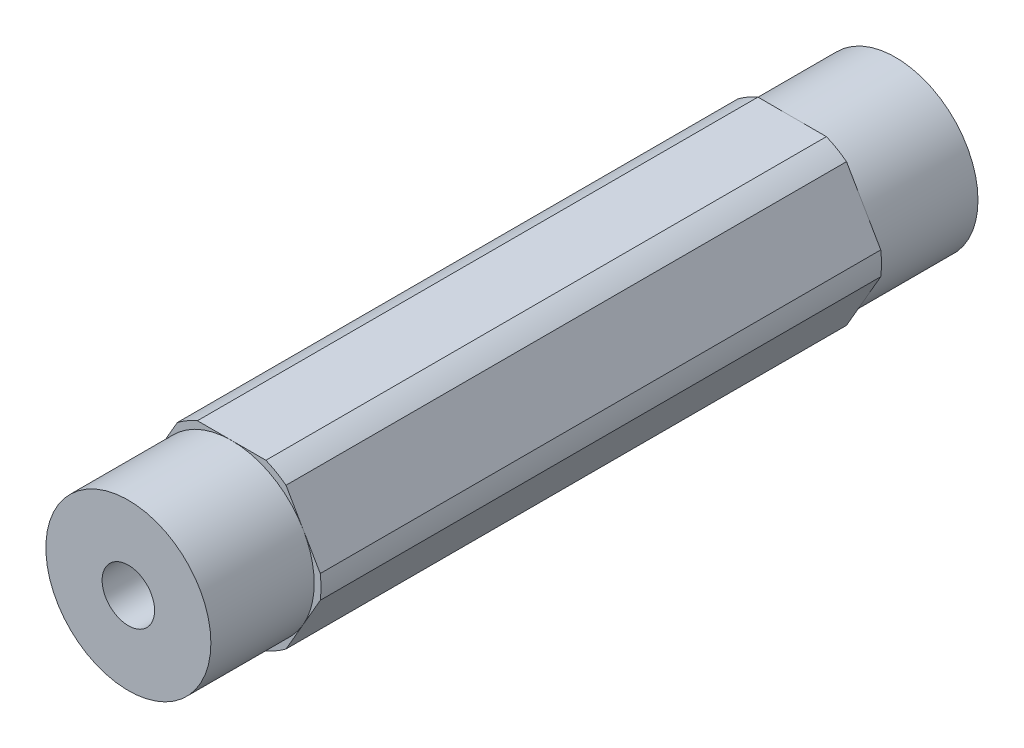
ISO-10303-21;
HEADER;
FILE_DESCRIPTION(('STEP AP214'),'2;1');
FILE_NAME('part.step','',(''),(''),'','','');
FILE_SCHEMA(('AUTOMOTIVE_DESIGN { 1 0 10303 214 1 1 1 1 }'));
ENDSEC;
DATA;
#1=APPLICATION_CONTEXT('core data for automotive mechanical design processes');
#2=APPLICATION_PROTOCOL_DEFINITION('international standard','automotive_design',2000,#1);
#3=PRODUCT_CONTEXT('',#1,'mechanical');
#4=PRODUCT('Part','Part','',(#3));
#5=PRODUCT_RELATED_PRODUCT_CATEGORY('part','',(#4));
#6=PRODUCT_DEFINITION_FORMATION('','',#4);
#7=PRODUCT_DEFINITION_CONTEXT('part definition',#1,'design');
#8=PRODUCT_DEFINITION('design','',#6,#7);
#9=PRODUCT_DEFINITION_SHAPE('','',#8);
#10=(LENGTH_UNIT() NAMED_UNIT(*) SI_UNIT(.MILLI.,.METRE.));
#11=(NAMED_UNIT(*) PLANE_ANGLE_UNIT() SI_UNIT($,.RADIAN.));
#12=(NAMED_UNIT(*) SI_UNIT($,.STERADIAN.) SOLID_ANGLE_UNIT());
#13=UNCERTAINTY_MEASURE_WITH_UNIT(LENGTH_MEASURE(1.E-05),#10,'distance_accuracy_value','');
#14=(GEOMETRIC_REPRESENTATION_CONTEXT(3) GLOBAL_UNCERTAINTY_ASSIGNED_CONTEXT((#13)) GLOBAL_UNIT_ASSIGNED_CONTEXT((#10,
#11,#12)) REPRESENTATION_CONTEXT('',''));
#15=CARTESIAN_POINT('',(0.,0.,0.));
#16=DIRECTION('',(0.,0.,1.));
#17=DIRECTION('',(1.,0.,0.));
#18=AXIS2_PLACEMENT_3D('',#15,#16,#17);
#19=CARTESIAN_POINT('',(3.66617420935409,6.34999999999998,29.51734));
#20=DIRECTION('',(0.,-1.,0.));
#21=DIRECTION('',(1.,0.,0.));
#22=AXIS2_PLACEMENT_3D('',#19,#20,#21);
#23=PLANE('',#22);
#24=DIRECTION('',(1.,0.,0.));
#25=VECTOR('',#24,1.);
#26=CARTESIAN_POINT('',(3.66617420935409,6.34999999999998,-21.56714));
#27=LINE('',#26,#25);
#28=CARTESIAN_POINT('',(-2.63498102459971,6.34999999999996,-21.56714));
#29=VERTEX_POINT('',#28);
#30=CARTESIAN_POINT('',(0.,6.34999999999997,-21.56714));
#31=VERTEX_POINT('',#30);
#32=EDGE_CURVE('E216',#29,#31,#27,.T.);
#33=ORIENTED_EDGE('',*,*,#32,.F.);
#34=DIRECTION('',(0.,0.,1.));
#35=VECTOR('',#34,1.);
#36=CARTESIAN_POINT('',(-2.63498102459971,6.34999999999996,-29.51734));
#37=LINE('',#36,#35);
#38=CARTESIAN_POINT('',(-2.63498102459971,6.34999999999996,21.56714));
#39=VERTEX_POINT('',#38);
#40=EDGE_CURVE('E294',#39,#29,#37,.F.);
#41=ORIENTED_EDGE('',*,*,#40,.F.);
#42=DIRECTION('',(-1.,0.,0.));
#43=VECTOR('',#42,1.);
#44=CARTESIAN_POINT('',(3.66617420935409,6.34999999999998,21.56714));
#45=LINE('',#44,#43);
#46=CARTESIAN_POINT('',(0.,6.34999999999997,21.56714));
#47=VERTEX_POINT('',#46);
#48=EDGE_CURVE('E332',#47,#39,#45,.T.);
#49=ORIENTED_EDGE('',*,*,#48,.F.);
#50=CARTESIAN_POINT('',(2.63498102459967,6.34999999999997,21.56714));
#51=VERTEX_POINT('',#50);
#52=EDGE_CURVE('E336',#51,#47,#45,.T.);
#53=ORIENTED_EDGE('',*,*,#52,.F.);
#54=DIRECTION('',(0.,0.,1.));
#55=VECTOR('',#54,1.);
#56=CARTESIAN_POINT('',(2.63498102459967,6.34999999999997,-29.51734));
#57=LINE('',#56,#55);
#58=CARTESIAN_POINT('',(2.63498102459967,6.34999999999997,-21.56714));
#59=VERTEX_POINT('',#58);
#60=EDGE_CURVE('E69',#59,#51,#57,.T.);
#61=ORIENTED_EDGE('',*,*,#60,.F.);
#62=EDGE_CURVE('E63',#31,#59,#27,.T.);
#63=ORIENTED_EDGE('',*,*,#62,.F.);
#64=EDGE_LOOP('',(#33,#41,#49,#53,#61,#63));
#65=FACE_BOUND('',#64,.T.);
#66=ADVANCED_FACE('F48',(#65),#23,.F.);
#67=CARTESIAN_POINT('',(-3.66617420935414,6.34999999999995,29.51734));
#68=DIRECTION('',(0.866025403784441,-0.499999999999995,0.));
#69=DIRECTION('',(0.499999999999995,0.866025403784442,0.));
#70=AXIS2_PLACEMENT_3D('',#67,#68,#69);
#71=PLANE('',#70);
#72=DIRECTION('',(0.499999999999995,0.866025403784442,0.));
#73=VECTOR('',#72,1.);
#74=CARTESIAN_POINT('',(-3.66617420935414,6.34999999999995,-21.56714));
#75=LINE('',#74,#73);
#76=CARTESIAN_POINT('',(-6.816751826331,0.893039494206666,-21.56714));
#77=VERTEX_POINT('',#76);
#78=CARTESIAN_POINT('',(-5.49926131403117,3.17499999999995,-21.56714));
#79=VERTEX_POINT('',#78);
#80=EDGE_CURVE('E213',#77,#79,#75,.T.);
#81=ORIENTED_EDGE('',*,*,#80,.F.);
#82=DIRECTION('',(0.,0.,1.));
#83=VECTOR('',#82,1.);
#84=CARTESIAN_POINT('',(-6.81675182633101,0.893039494206661,-29.51734));
#85=LINE('',#84,#83);
#86=CARTESIAN_POINT('',(-6.81675182633101,0.893039494206666,21.56714));
#87=VERTEX_POINT('',#86);
#88=EDGE_CURVE('E283',#87,#77,#85,.F.);
#89=ORIENTED_EDGE('',*,*,#88,.F.);
#90=DIRECTION('',(-0.499999999999995,-0.866025403784442,0.));
#91=VECTOR('',#90,1.);
#92=CARTESIAN_POINT('',(-3.66617420935414,6.34999999999995,21.56714));
#93=LINE('',#92,#91);
#94=CARTESIAN_POINT('',(-5.49926131403117,3.17499999999995,21.56714));
#95=VERTEX_POINT('',#94);
#96=EDGE_CURVE('E327',#95,#87,#93,.T.);
#97=ORIENTED_EDGE('',*,*,#96,.F.);
#98=CARTESIAN_POINT('',(-4.18177080173135,5.45696050579324,21.56714));
#99=VERTEX_POINT('',#98);
#100=EDGE_CURVE('E331',#99,#95,#93,.T.);
#101=ORIENTED_EDGE('',*,*,#100,.F.);
#102=DIRECTION('',(0.,0.,1.));
#103=VECTOR('',#102,1.);
#104=CARTESIAN_POINT('',(-4.18177080173134,5.45696050579324,-29.51734));
#105=LINE('',#104,#103);
#106=CARTESIAN_POINT('',(-4.18177080173134,5.45696050579324,-21.56714));
#107=VERTEX_POINT('',#106);
#108=EDGE_CURVE('E291',#107,#99,#105,.T.);
#109=ORIENTED_EDGE('',*,*,#108,.F.);
#110=EDGE_CURVE('E209',#79,#107,#75,.T.);
#111=ORIENTED_EDGE('',*,*,#110,.F.);
#112=EDGE_LOOP('',(#81,#89,#97,#101,#109,#111));
#113=FACE_BOUND('',#112,.T.);
#114=ADVANCED_FACE('F405',(#113),#71,.F.);
#115=CARTESIAN_POINT('',(-7.33234841870821,0.,29.51734));
#116=DIRECTION('',(0.866025403784434,0.500000000000007,0.));
#117=DIRECTION('',(-0.500000000000007,0.866025403784435,0.));
#118=AXIS2_PLACEMENT_3D('',#115,#116,#117);
#119=PLANE('',#118);
#120=DIRECTION('',(-0.500000000000007,0.866025403784435,0.));
#121=VECTOR('',#120,1.);
#122=CARTESIAN_POINT('',(-7.33234841870821,0.,-21.56714));
#123=LINE('',#122,#121);
#124=CARTESIAN_POINT('',(-4.18177080173127,-5.4569605057933,-21.56714));
#125=VERTEX_POINT('',#124);
#126=CARTESIAN_POINT('',(-5.49926131403113,-3.17500000000003,-21.56714));
#127=VERTEX_POINT('',#126);
#128=EDGE_CURVE('E235',#125,#127,#123,.T.);
#129=ORIENTED_EDGE('',*,*,#128,.F.);
#130=DIRECTION('',(0.,0.,1.));
#131=VECTOR('',#130,1.);
#132=CARTESIAN_POINT('',(-4.18177080173126,-5.4569605057933,-29.51734));
#133=LINE('',#132,#131);
#134=CARTESIAN_POINT('',(-4.18177080173127,-5.4569605057933,21.56714));
#135=VERTEX_POINT('',#134);
#136=EDGE_CURVE('E272',#135,#125,#133,.F.);
#137=ORIENTED_EDGE('',*,*,#136,.F.);
#138=DIRECTION('',(0.500000000000007,-0.866025403784435,0.));
#139=VECTOR('',#138,1.);
#140=CARTESIAN_POINT('',(-7.33234841870821,0.,21.56714));
#141=LINE('',#140,#139);
#142=CARTESIAN_POINT('',(-5.49926131403113,-3.17500000000003,21.56714));
#143=VERTEX_POINT('',#142);
#144=EDGE_CURVE('E322',#143,#135,#141,.T.);
#145=ORIENTED_EDGE('',*,*,#144,.F.);
#146=CARTESIAN_POINT('',(-6.81675182633099,-0.893039494206761,21.56714));
#147=VERTEX_POINT('',#146);
#148=EDGE_CURVE('E326',#147,#143,#141,.T.);
#149=ORIENTED_EDGE('',*,*,#148,.F.);
#150=DIRECTION('',(0.,0.,1.));
#151=VECTOR('',#150,1.);
#152=CARTESIAN_POINT('',(-6.81675182633099,-0.893039494206754,-29.51734));
#153=LINE('',#152,#151);
#154=CARTESIAN_POINT('',(-6.81675182633099,-0.893039494206759,-21.56714));
#155=VERTEX_POINT('',#154);
#156=EDGE_CURVE('E280',#155,#147,#153,.T.);
#157=ORIENTED_EDGE('',*,*,#156,.F.);
#158=EDGE_CURVE('E231',#127,#155,#123,.T.);
#159=ORIENTED_EDGE('',*,*,#158,.F.);
#160=EDGE_LOOP('',(#129,#137,#145,#149,#157,#159));
#161=FACE_BOUND('',#160,.T.);
#162=ADVANCED_FACE('F457',(#161),#119,.F.);
#163=CARTESIAN_POINT('',(-3.66617420935405,-6.35,29.51734));
#164=DIRECTION('',(0.,1.,0.));
#165=DIRECTION('',(-1.,0.,0.));
#166=AXIS2_PLACEMENT_3D('',#163,#164,#165);
#167=PLANE('',#166);
#168=DIRECTION('',(-1.,0.,0.));
#169=VECTOR('',#168,1.);
#170=CARTESIAN_POINT('',(-3.66617420935405,-6.35,-21.56714));
#171=LINE('',#170,#169);
#172=CARTESIAN_POINT('',(2.63498102459976,-6.34999999999994,-21.56714));
#173=VERTEX_POINT('',#172);
#174=CARTESIAN_POINT('',(0.,-6.34999999999997,-21.56714));
#175=VERTEX_POINT('',#174);
#176=EDGE_CURVE('E243',#173,#175,#171,.T.);
#177=ORIENTED_EDGE('',*,*,#176,.F.);
#178=DIRECTION('',(0.,0.,1.));
#179=VECTOR('',#178,1.);
#180=CARTESIAN_POINT('',(2.63498102459976,-6.34999999999994,-29.51734));
#181=LINE('',#180,#179);
#182=CARTESIAN_POINT('',(2.63498102459976,-6.34999999999994,21.56714));
#183=VERTEX_POINT('',#182);
#184=EDGE_CURVE('E261',#183,#173,#181,.F.);
#185=ORIENTED_EDGE('',*,*,#184,.F.);
#186=DIRECTION('',(1.,0.,0.));
#187=VECTOR('',#186,1.);
#188=CARTESIAN_POINT('',(-3.66617420935405,-6.35,21.56714));
#189=LINE('',#188,#187);
#190=CARTESIAN_POINT('',(0.,-6.34999999999997,21.56714));
#191=VERTEX_POINT('',#190);
#192=EDGE_CURVE('E317',#191,#183,#189,.T.);
#193=ORIENTED_EDGE('',*,*,#192,.F.);
#194=CARTESIAN_POINT('',(-2.63498102459963,-6.34999999999999,21.56714));
#195=VERTEX_POINT('',#194);
#196=EDGE_CURVE('E321',#195,#191,#189,.T.);
#197=ORIENTED_EDGE('',*,*,#196,.F.);
#198=DIRECTION('',(0.,0.,1.));
#199=VECTOR('',#198,1.);
#200=CARTESIAN_POINT('',(-2.63498102459963,-6.34999999999999,-29.51734));
#201=LINE('',#200,#199);
#202=CARTESIAN_POINT('',(-2.63498102459963,-6.34999999999999,-21.56714));
#203=VERTEX_POINT('',#202);
#204=EDGE_CURVE('E269',#203,#195,#201,.T.);
#205=ORIENTED_EDGE('',*,*,#204,.F.);
#206=EDGE_CURVE('E240',#175,#203,#171,.T.);
#207=ORIENTED_EDGE('',*,*,#206,.F.);
#208=EDGE_LOOP('',(#177,#185,#193,#197,#205,#207));
#209=FACE_BOUND('',#208,.T.);
#210=ADVANCED_FACE('F427',(#209),#167,.F.);
#211=CARTESIAN_POINT('',(3.66617420935418,-6.34999999999993,29.51734));
#212=DIRECTION('',(-0.866025403784442,0.499999999999995,0.));
#213=DIRECTION('',(-0.499999999999995,-0.866025403784442,0.));
#214=AXIS2_PLACEMENT_3D('',#211,#212,#213);
#215=PLANE('',#214);
#216=DIRECTION('',(-0.499999999999995,-0.866025403784442,0.));
#217=VECTOR('',#216,1.);
#218=CARTESIAN_POINT('',(3.66617420935418,-6.34999999999993,-21.56714));
#219=LINE('',#218,#217);
#220=CARTESIAN_POINT('',(6.816751826331,-0.893039494206728,-21.56714));
#221=VERTEX_POINT('',#220);
#222=CARTESIAN_POINT('',(5.49926131403117,-3.17499999999995,-21.56714));
#223=VERTEX_POINT('',#222);
#224=EDGE_CURVE('E189',#221,#223,#219,.T.);
#225=ORIENTED_EDGE('',*,*,#224,.F.);
#226=DIRECTION('',(0.,0.,1.));
#227=VECTOR('',#226,1.);
#228=CARTESIAN_POINT('',(6.816751826331,-0.893039494206728,-29.51734));
#229=LINE('',#228,#227);
#230=CARTESIAN_POINT('',(6.816751826331,-0.893039494206728,21.56714));
#231=VERTEX_POINT('',#230);
#232=EDGE_CURVE('E250',#231,#221,#229,.F.);
#233=ORIENTED_EDGE('',*,*,#232,.F.);
#234=DIRECTION('',(0.499999999999995,0.866025403784442,0.));
#235=VECTOR('',#234,1.);
#236=CARTESIAN_POINT('',(3.66617420935418,-6.34999999999993,21.56714));
#237=LINE('',#236,#235);
#238=CARTESIAN_POINT('',(5.49926131403117,-3.17499999999995,21.56714));
#239=VERTEX_POINT('',#238);
#240=EDGE_CURVE('E311',#239,#231,#237,.T.);
#241=ORIENTED_EDGE('',*,*,#240,.F.);
#242=CARTESIAN_POINT('',(4.18177080173139,-5.4569605057932,21.56714));
#243=VERTEX_POINT('',#242);
#244=EDGE_CURVE('E316',#243,#239,#237,.T.);
#245=ORIENTED_EDGE('',*,*,#244,.F.);
#246=DIRECTION('',(0.,0.,1.));
#247=VECTOR('',#246,1.);
#248=CARTESIAN_POINT('',(4.18177080173139,-5.4569605057932,-29.51734));
#249=LINE('',#248,#247);
#250=CARTESIAN_POINT('',(4.18177080173139,-5.4569605057932,-21.56714));
#251=VERTEX_POINT('',#250);
#252=EDGE_CURVE('E258',#251,#243,#249,.T.);
#253=ORIENTED_EDGE('',*,*,#252,.F.);
#254=EDGE_CURVE('E232',#223,#251,#219,.T.);
#255=ORIENTED_EDGE('',*,*,#254,.F.);
#256=EDGE_LOOP('',(#225,#233,#241,#245,#253,#255));
#257=FACE_BOUND('',#256,.T.);
#258=ADVANCED_FACE('F434',(#257),#215,.F.);
#259=CARTESIAN_POINT('',(7.33234841870821,0.,29.51734));
#260=DIRECTION('',(-0.866025403784438,-0.500000000000001,0.));
#261=DIRECTION('',(0.500000000000001,-0.866025403784438,0.));
#262=AXIS2_PLACEMENT_3D('',#259,#260,#261);
#263=PLANE('',#262);
#264=DIRECTION('',(0.500000000000001,-0.866025403784438,0.));
#265=VECTOR('',#264,1.);
#266=CARTESIAN_POINT('',(7.33234841870821,0.,-21.56714));
#267=LINE('',#266,#265);
#268=CARTESIAN_POINT('',(4.1817708017313,5.45696050579327,-21.56714));
#269=VERTEX_POINT('',#268);
#270=CARTESIAN_POINT('',(5.49926131403115,3.17499999999999,-21.56714));
#271=VERTEX_POINT('',#270);
#272=EDGE_CURVE('E171',#269,#271,#267,.T.);
#273=ORIENTED_EDGE('',*,*,#272,.F.);
#274=DIRECTION('',(0.,0.,1.));
#275=VECTOR('',#274,1.);
#276=CARTESIAN_POINT('',(4.1817708017313,5.45696050579327,-29.51734));
#277=LINE('',#276,#275);
#278=CARTESIAN_POINT('',(4.18177080173131,5.45696050579327,21.56714));
#279=VERTEX_POINT('',#278);
#280=EDGE_CURVE('E301',#279,#269,#277,.F.);
#281=ORIENTED_EDGE('',*,*,#280,.F.);
#282=DIRECTION('',(-0.500000000000001,0.866025403784438,0.));
#283=VECTOR('',#282,1.);
#284=CARTESIAN_POINT('',(7.33234841870821,0.,21.56714));
#285=LINE('',#284,#283);
#286=CARTESIAN_POINT('',(5.49926131403115,3.17499999999999,21.56714));
#287=VERTEX_POINT('',#286);
#288=EDGE_CURVE('E341',#287,#279,#285,.T.);
#289=ORIENTED_EDGE('',*,*,#288,.F.);
#290=CARTESIAN_POINT('',(6.816751826331,0.893039494206714,21.56714));
#291=VERTEX_POINT('',#290);
#292=EDGE_CURVE('E344',#291,#287,#285,.T.);
#293=ORIENTED_EDGE('',*,*,#292,.F.);
#294=DIRECTION('',(0.,0.,1.));
#295=VECTOR('',#294,1.);
#296=CARTESIAN_POINT('',(6.816751826331,0.89303949420671,-29.51734));
#297=LINE('',#296,#295);
#298=CARTESIAN_POINT('',(6.816751826331,0.89303949420671,-21.56714));
#299=VERTEX_POINT('',#298);
#300=EDGE_CURVE('E207',#299,#291,#297,.T.);
#301=ORIENTED_EDGE('',*,*,#300,.F.);
#302=EDGE_CURVE('E182',#271,#299,#267,.T.);
#303=ORIENTED_EDGE('',*,*,#302,.F.);
#304=EDGE_LOOP('',(#273,#281,#289,#293,#301,#303));
#305=FACE_BOUND('',#304,.T.);
#306=ADVANCED_FACE('F205',(#305),#263,.F.);
#307=CARTESIAN_POINT('',(0.,0.,-29.51734));
#308=DIRECTION('',(0.,0.,1.));
#309=DIRECTION('',(1.,0.,0.));
#310=AXIS2_PLACEMENT_3D('',#307,#308,#309);
#311=CYLINDRICAL_SURFACE('',#310,6.875);
#312=ORIENTED_EDGE('',*,*,#232,.T.);
#313=CARTESIAN_POINT('',(0.,0.,-21.56714));
#314=DIRECTION('',(0.,0.,-1.));
#315=DIRECTION('',(-1.,0.,0.));
#316=AXIS2_PLACEMENT_3D('',#313,#314,#315);
#317=CIRCLE('',#316,6.875);
#318=EDGE_CURVE('E226',#221,#299,#317,.F.);
#319=ORIENTED_EDGE('',*,*,#318,.T.);
#320=ORIENTED_EDGE('',*,*,#300,.T.);
#321=CARTESIAN_POINT('',(0.,0.,21.56714));
#322=DIRECTION('',(0.,0.,1.));
#323=DIRECTION('',(1.,0.,0.));
#324=AXIS2_PLACEMENT_3D('',#321,#322,#323);
#325=CIRCLE('',#324,6.875);
#326=EDGE_CURVE('E56',#231,#291,#325,.T.);
#327=ORIENTED_EDGE('',*,*,#326,.F.);
#328=EDGE_LOOP('',(#312,#319,#320,#327));
#329=FACE_BOUND('',#328,.T.);
#330=ADVANCED_FACE('F438',(#329),#311,.T.);
#331=ORIENTED_EDGE('',*,*,#184,.T.);
#332=CARTESIAN_POINT('',(0.,0.,-21.56714));
#333=DIRECTION('',(0.,0.,-1.));
#334=DIRECTION('',(-1.,0.,0.));
#335=AXIS2_PLACEMENT_3D('',#332,#333,#334);
#336=CIRCLE('',#335,6.875);
#337=EDGE_CURVE('E244',#173,#251,#336,.F.);
#338=ORIENTED_EDGE('',*,*,#337,.T.);
#339=ORIENTED_EDGE('',*,*,#252,.T.);
#340=CARTESIAN_POINT('',(0.,0.,21.56714));
#341=DIRECTION('',(0.,0.,1.));
#342=DIRECTION('',(1.,0.,0.));
#343=AXIS2_PLACEMENT_3D('',#340,#341,#342);
#344=CIRCLE('',#343,6.875);
#345=EDGE_CURVE('E254',#183,#243,#344,.T.);
#346=ORIENTED_EDGE('',*,*,#345,.F.);
#347=EDGE_LOOP('',(#331,#338,#339,#346));
#348=FACE_BOUND('',#347,.T.);
#349=ADVANCED_FACE('F440',(#348),#311,.T.);
#350=ORIENTED_EDGE('',*,*,#136,.T.);
#351=CARTESIAN_POINT('',(0.,0.,-21.56714));
#352=DIRECTION('',(0.,0.,-1.));
#353=DIRECTION('',(-1.,0.,0.));
#354=AXIS2_PLACEMENT_3D('',#351,#352,#353);
#355=CIRCLE('',#354,6.875);
#356=EDGE_CURVE('E236',#125,#203,#355,.F.);
#357=ORIENTED_EDGE('',*,*,#356,.T.);
#358=ORIENTED_EDGE('',*,*,#204,.T.);
#359=CARTESIAN_POINT('',(0.,0.,21.56714));
#360=DIRECTION('',(0.,0.,1.));
#361=DIRECTION('',(1.,0.,0.));
#362=AXIS2_PLACEMENT_3D('',#359,#360,#361);
#363=CIRCLE('',#362,6.875);
#364=EDGE_CURVE('E265',#135,#195,#363,.T.);
#365=ORIENTED_EDGE('',*,*,#364,.F.);
#366=EDGE_LOOP('',(#350,#357,#358,#365));
#367=FACE_BOUND('',#366,.T.);
#368=ADVANCED_FACE('F446',(#367),#311,.T.);
#369=ORIENTED_EDGE('',*,*,#88,.T.);
#370=CARTESIAN_POINT('',(0.,0.,-21.56714));
#371=DIRECTION('',(0.,0.,-1.));
#372=DIRECTION('',(-1.,0.,0.));
#373=AXIS2_PLACEMENT_3D('',#370,#371,#372);
#374=CIRCLE('',#373,6.875);
#375=EDGE_CURVE('E222',#77,#155,#374,.F.);
#376=ORIENTED_EDGE('',*,*,#375,.T.);
#377=ORIENTED_EDGE('',*,*,#156,.T.);
#378=CARTESIAN_POINT('',(0.,0.,21.56714));
#379=DIRECTION('',(0.,0.,1.));
#380=DIRECTION('',(1.,0.,0.));
#381=AXIS2_PLACEMENT_3D('',#378,#379,#380);
#382=CIRCLE('',#381,6.875);
#383=EDGE_CURVE('E276',#87,#147,#382,.T.);
#384=ORIENTED_EDGE('',*,*,#383,.F.);
#385=EDGE_LOOP('',(#369,#376,#377,#384));
#386=FACE_BOUND('',#385,.T.);
#387=ADVANCED_FACE('F518',(#386),#311,.T.);
#388=ORIENTED_EDGE('',*,*,#40,.T.);
#389=CARTESIAN_POINT('',(0.,0.,-21.56714));
#390=DIRECTION('',(0.,0.,-1.));
#391=DIRECTION('',(-1.,0.,0.));
#392=AXIS2_PLACEMENT_3D('',#389,#390,#391);
#393=CIRCLE('',#392,6.875);
#394=EDGE_CURVE('E210',#29,#107,#393,.F.);
#395=ORIENTED_EDGE('',*,*,#394,.T.);
#396=ORIENTED_EDGE('',*,*,#108,.T.);
#397=CARTESIAN_POINT('',(0.,0.,21.56714));
#398=DIRECTION('',(0.,0.,1.));
#399=DIRECTION('',(1.,0.,0.));
#400=AXIS2_PLACEMENT_3D('',#397,#398,#399);
#401=CIRCLE('',#400,6.875);
#402=EDGE_CURVE('E287',#39,#99,#401,.T.);
#403=ORIENTED_EDGE('',*,*,#402,.F.);
#404=EDGE_LOOP('',(#388,#395,#396,#403));
#405=FACE_BOUND('',#404,.T.);
#406=ADVANCED_FACE('F409',(#405),#311,.T.);
#407=ORIENTED_EDGE('',*,*,#280,.T.);
#408=CARTESIAN_POINT('',(0.,0.,-21.56714));
#409=DIRECTION('',(0.,0.,-1.));
#410=DIRECTION('',(-1.,0.,0.));
#411=AXIS2_PLACEMENT_3D('',#408,#409,#410);
#412=CIRCLE('',#411,6.875);
#413=EDGE_CURVE('E12',#269,#59,#412,.F.);
#414=ORIENTED_EDGE('',*,*,#413,.T.);
#415=ORIENTED_EDGE('',*,*,#60,.T.);
#416=CARTESIAN_POINT('',(0.,0.,21.56714));
#417=DIRECTION('',(0.,0.,1.));
#418=DIRECTION('',(1.,0.,0.));
#419=AXIS2_PLACEMENT_3D('',#416,#417,#418);
#420=CIRCLE('',#419,6.875);
#421=EDGE_CURVE('E298',#279,#51,#420,.T.);
#422=ORIENTED_EDGE('',*,*,#421,.F.);
#423=EDGE_LOOP('',(#407,#414,#415,#422));
#424=FACE_BOUND('',#423,.T.);
#425=ADVANCED_FACE('F368',(#424),#311,.T.);
#426=CARTESIAN_POINT('',(0.,0.,21.56714));
#427=DIRECTION('',(0.,0.,1.));
#428=DIRECTION('',(1.,0.,0.));
#429=AXIS2_PLACEMENT_3D('',#426,#427,#428);
#430=PLANE('',#429);
#431=ORIENTED_EDGE('',*,*,#288,.T.);
#432=ORIENTED_EDGE('',*,*,#421,.T.);
#433=ORIENTED_EDGE('',*,*,#52,.T.);
#434=CARTESIAN_POINT('',(0.,0.,21.56714));
#435=DIRECTION('',(0.,0.,1.));
#436=DIRECTION('',(1.,0.,0.));
#437=AXIS2_PLACEMENT_3D('',#434,#435,#436);
#438=CIRCLE('',#437,6.34999999999997);
#439=EDGE_CURVE('E307',#287,#47,#438,.T.);
#440=ORIENTED_EDGE('',*,*,#439,.F.);
#441=EDGE_LOOP('',(#431,#432,#433,#440));
#442=FACE_BOUND('',#441,.T.);
#443=ADVANCED_FACE('F356',(#442),#430,.T.);
#444=ORIENTED_EDGE('',*,*,#48,.T.);
#445=ORIENTED_EDGE('',*,*,#402,.T.);
#446=ORIENTED_EDGE('',*,*,#100,.T.);
#447=EDGE_CURVE('E312',#47,#95,#438,.T.);
#448=ORIENTED_EDGE('',*,*,#447,.F.);
#449=EDGE_LOOP('',(#444,#445,#446,#448));
#450=FACE_BOUND('',#449,.T.);
#451=ADVANCED_FACE('F411',(#450),#430,.T.);
#452=ORIENTED_EDGE('',*,*,#96,.T.);
#453=ORIENTED_EDGE('',*,*,#383,.T.);
#454=ORIENTED_EDGE('',*,*,#148,.T.);
#455=EDGE_CURVE('E379',#95,#143,#438,.T.);
#456=ORIENTED_EDGE('',*,*,#455,.F.);
#457=EDGE_LOOP('',(#452,#453,#454,#456));
#458=FACE_BOUND('',#457,.T.);
#459=ADVANCED_FACE('F415',(#458),#430,.T.);
#460=ORIENTED_EDGE('',*,*,#144,.T.);
#461=ORIENTED_EDGE('',*,*,#364,.T.);
#462=ORIENTED_EDGE('',*,*,#196,.T.);
#463=EDGE_CURVE('E382',#143,#191,#438,.T.);
#464=ORIENTED_EDGE('',*,*,#463,.F.);
#465=EDGE_LOOP('',(#460,#461,#462,#464));
#466=FACE_BOUND('',#465,.T.);
#467=ADVANCED_FACE('F421',(#466),#430,.T.);
#468=ORIENTED_EDGE('',*,*,#192,.T.);
#469=ORIENTED_EDGE('',*,*,#345,.T.);
#470=ORIENTED_EDGE('',*,*,#244,.T.);
#471=EDGE_CURVE('E365',#191,#239,#438,.T.);
#472=ORIENTED_EDGE('',*,*,#471,.F.);
#473=EDGE_LOOP('',(#468,#469,#470,#472));
#474=FACE_BOUND('',#473,.T.);
#475=ADVANCED_FACE('F430',(#474),#430,.T.);
#476=ORIENTED_EDGE('',*,*,#240,.T.);
#477=ORIENTED_EDGE('',*,*,#326,.T.);
#478=ORIENTED_EDGE('',*,*,#292,.T.);
#479=EDGE_CURVE('E306',#239,#287,#438,.T.);
#480=ORIENTED_EDGE('',*,*,#479,.F.);
#481=EDGE_LOOP('',(#476,#477,#478,#480));
#482=FACE_BOUND('',#481,.T.);
#483=ADVANCED_FACE('F351',(#482),#430,.T.);
#484=CARTESIAN_POINT('',(0.,0.,21.56714));
#485=DIRECTION('',(0.,0.,1.));
#486=DIRECTION('',(1.,0.,0.));
#487=AXIS2_PLACEMENT_3D('',#484,#485,#486);
#488=CYLINDRICAL_SURFACE('',#487,6.34999999999997);
#489=CARTESIAN_POINT('',(0.,0.,29.51734));
#490=DIRECTION('',(0.,0.,1.));
#491=DIRECTION('',(1.,0.,0.));
#492=AXIS2_PLACEMENT_3D('',#489,#490,#491);
#493=CIRCLE('',#492,6.34999999999997);
#494=CARTESIAN_POINT('',(6.34999999999997,0.,29.51734));
#495=VERTEX_POINT('',#494);
#496=EDGE_CURVE('E337',#495,#495,#493,.T.);
#497=ORIENTED_EDGE('',*,*,#496,.F.);
#498=EDGE_LOOP('',(#497));
#499=FACE_BOUND('',#498,.T.);
#500=ORIENTED_EDGE('',*,*,#439,.T.);
#501=ORIENTED_EDGE('',*,*,#447,.T.);
#502=ORIENTED_EDGE('',*,*,#455,.T.);
#503=ORIENTED_EDGE('',*,*,#463,.T.);
#504=ORIENTED_EDGE('',*,*,#471,.T.);
#505=ORIENTED_EDGE('',*,*,#479,.T.);
#506=EDGE_LOOP('',(#500,#501,#502,#503,#504,#505));
#507=FACE_BOUND('',#506,.T.);
#508=ADVANCED_FACE('F362',(#499,#507),#488,.T.);
#509=CARTESIAN_POINT('',(0.,0.,29.51734));
#510=DIRECTION('',(0.,0.,1.));
#511=DIRECTION('',(1.,0.,0.));
#512=AXIS2_PLACEMENT_3D('',#509,#510,#511);
#513=PLANE('',#512);
#514=CARTESIAN_POINT('',(0.,0.,29.51734));
#515=DIRECTION('',(0.,0.,1.));
#516=DIRECTION('',(1.,0.,0.));
#517=AXIS2_PLACEMENT_3D('',#514,#515,#516);
#518=CIRCLE('',#517,2.0193);
#519=CARTESIAN_POINT('',(2.0193,0.,29.51734));
#520=VERTEX_POINT('',#519);
#521=EDGE_CURVE('E676',#520,#520,#518,.T.);
#522=ORIENTED_EDGE('',*,*,#521,.F.);
#523=EDGE_LOOP('',(#522));
#524=FACE_BOUND('',#523,.T.);
#525=ORIENTED_EDGE('',*,*,#496,.T.);
#526=EDGE_LOOP('',(#525));
#527=FACE_BOUND('',#526,.T.);
#528=ADVANCED_FACE('F473',(#524,#527),#513,.T.);
#529=CARTESIAN_POINT('',(0.,0.,-21.56714));
#530=DIRECTION('',(0.,0.,-1.));
#531=DIRECTION('',(-1.,0.,0.));
#532=AXIS2_PLACEMENT_3D('',#529,#530,#531);
#533=CYLINDRICAL_SURFACE('',#532,6.34999999999997);
#534=CARTESIAN_POINT('',(0.,0.,-21.56714));
#535=DIRECTION('',(0.,0.,1.));
#536=DIRECTION('',(1.,0.,0.));
#537=AXIS2_PLACEMENT_3D('',#534,#535,#536);
#538=CIRCLE('',#537,6.34999999999997);
#539=EDGE_CURVE('E202',#31,#79,#538,.T.);
#540=ORIENTED_EDGE('',*,*,#539,.F.);
#541=EDGE_CURVE('E175',#271,#31,#538,.T.);
#542=ORIENTED_EDGE('',*,*,#541,.F.);
#543=EDGE_CURVE('E185',#223,#271,#538,.T.);
#544=ORIENTED_EDGE('',*,*,#543,.F.);
#545=EDGE_CURVE('E194',#175,#223,#538,.T.);
#546=ORIENTED_EDGE('',*,*,#545,.F.);
#547=EDGE_CURVE('E399',#127,#175,#538,.T.);
#548=ORIENTED_EDGE('',*,*,#547,.F.);
#549=EDGE_CURVE('E392',#79,#127,#538,.T.);
#550=ORIENTED_EDGE('',*,*,#549,.F.);
#551=EDGE_LOOP('',(#540,#542,#544,#546,#548,#550));
#552=FACE_BOUND('',#551,.T.);
#553=CARTESIAN_POINT('',(0.,0.,-29.51734));
#554=DIRECTION('',(0.,0.,1.));
#555=DIRECTION('',(1.,0.,0.));
#556=AXIS2_PLACEMENT_3D('',#553,#554,#555);
#557=CIRCLE('',#556,6.34999999999997);
#558=CARTESIAN_POINT('',(6.34999999999997,0.,-29.51734));
#559=VERTEX_POINT('',#558);
#560=EDGE_CURVE('E195',#559,#559,#557,.T.);
#561=ORIENTED_EDGE('',*,*,#560,.T.);
#562=EDGE_LOOP('',(#561));
#563=FACE_BOUND('',#562,.T.);
#564=ADVANCED_FACE('F198',(#552,#563),#533,.T.);
#565=CARTESIAN_POINT('',(0.,0.,-21.56714));
#566=DIRECTION('',(0.,0.,-1.));
#567=DIRECTION('',(-1.,0.,0.));
#568=AXIS2_PLACEMENT_3D('',#565,#566,#567);
#569=PLANE('',#568);
#570=ORIENTED_EDGE('',*,*,#206,.T.);
#571=ORIENTED_EDGE('',*,*,#356,.F.);
#572=ORIENTED_EDGE('',*,*,#128,.T.);
#573=ORIENTED_EDGE('',*,*,#547,.T.);
#574=EDGE_LOOP('',(#570,#571,#572,#573));
#575=FACE_BOUND('',#574,.T.);
#576=ADVANCED_FACE('F584',(#575),#569,.T.);
#577=ORIENTED_EDGE('',*,*,#158,.T.);
#578=ORIENTED_EDGE('',*,*,#375,.F.);
#579=ORIENTED_EDGE('',*,*,#80,.T.);
#580=ORIENTED_EDGE('',*,*,#549,.T.);
#581=EDGE_LOOP('',(#577,#578,#579,#580));
#582=FACE_BOUND('',#581,.T.);
#583=ADVANCED_FACE('F391',(#582),#569,.T.);
#584=ORIENTED_EDGE('',*,*,#224,.T.);
#585=ORIENTED_EDGE('',*,*,#543,.T.);
#586=ORIENTED_EDGE('',*,*,#302,.T.);
#587=ORIENTED_EDGE('',*,*,#318,.F.);
#588=EDGE_LOOP('',(#584,#585,#586,#587));
#589=FACE_BOUND('',#588,.T.);
#590=ADVANCED_FACE('F186',(#589),#569,.T.);
#591=ORIENTED_EDGE('',*,*,#110,.T.);
#592=ORIENTED_EDGE('',*,*,#394,.F.);
#593=ORIENTED_EDGE('',*,*,#32,.T.);
#594=ORIENTED_EDGE('',*,*,#539,.T.);
#595=EDGE_LOOP('',(#591,#592,#593,#594));
#596=FACE_BOUND('',#595,.T.);
#597=ADVANCED_FACE('F402',(#596),#569,.T.);
#598=ORIENTED_EDGE('',*,*,#62,.T.);
#599=ORIENTED_EDGE('',*,*,#413,.F.);
#600=ORIENTED_EDGE('',*,*,#272,.T.);
#601=ORIENTED_EDGE('',*,*,#541,.T.);
#602=EDGE_LOOP('',(#598,#599,#600,#601));
#603=FACE_BOUND('',#602,.T.);
#604=ADVANCED_FACE('F173',(#603),#569,.T.);
#605=ORIENTED_EDGE('',*,*,#176,.T.);
#606=ORIENTED_EDGE('',*,*,#545,.T.);
#607=ORIENTED_EDGE('',*,*,#254,.T.);
#608=ORIENTED_EDGE('',*,*,#337,.F.);
#609=EDGE_LOOP('',(#605,#606,#607,#608));
#610=FACE_BOUND('',#609,.T.);
#611=ADVANCED_FACE('F471',(#610),#569,.T.);
#612=CARTESIAN_POINT('',(0.,0.,-29.51734));
#613=DIRECTION('',(0.,0.,1.));
#614=DIRECTION('',(1.,0.,0.));
#615=AXIS2_PLACEMENT_3D('',#612,#613,#614);
#616=PLANE('',#615);
#617=CARTESIAN_POINT('',(0.,0.,-29.51734));
#618=DIRECTION('',(0.,0.,1.));
#619=DIRECTION('',(1.,0.,0.));
#620=AXIS2_PLACEMENT_3D('',#617,#618,#619);
#621=CIRCLE('',#620,2.0193);
#622=CARTESIAN_POINT('',(2.0193,0.,-29.51734));
#623=VERTEX_POINT('',#622);
#624=EDGE_CURVE('E673',#623,#623,#621,.T.);
#625=ORIENTED_EDGE('',*,*,#624,.T.);
#626=EDGE_LOOP('',(#625));
#627=FACE_BOUND('',#626,.T.);
#628=ORIENTED_EDGE('',*,*,#560,.F.);
#629=EDGE_LOOP('',(#628));
#630=FACE_BOUND('',#629,.T.);
#631=ADVANCED_FACE('F467',(#627,#630),#616,.F.);
#632=CARTESIAN_POINT('',(0.,0.,-29.51734));
#633=DIRECTION('',(0.,0.,1.));
#634=DIRECTION('',(1.,0.,0.));
#635=AXIS2_PLACEMENT_3D('',#632,#633,#634);
#636=CYLINDRICAL_SURFACE('',#635,2.0193);
#637=ORIENTED_EDGE('',*,*,#624,.F.);
#638=EDGE_LOOP('',(#637));
#639=FACE_BOUND('',#638,.T.);
#640=ORIENTED_EDGE('',*,*,#521,.T.);
#641=EDGE_LOOP('',(#640));
#642=FACE_BOUND('',#641,.T.);
#643=ADVANCED_FACE('F470',(#639,#642),#636,.F.);
#644=CLOSED_SHELL('',(#66,#114,#162,#210,#258,#306,#330,#349,#368,#387,#406,#425,#443,#451,#459,
#467,#475,#483,#508,#528,#564,#576,#583,#590,#597,#604,#611,#631,#643));
#645=MANIFOLD_SOLID_BREP('B2',#644);
#646=ADVANCED_BREP_SHAPE_REPRESENTATION('',(#18,#645),#14);
#647=SHAPE_DEFINITION_REPRESENTATION(#9,#646);
ENDSEC;
END-ISO-10303-21;
